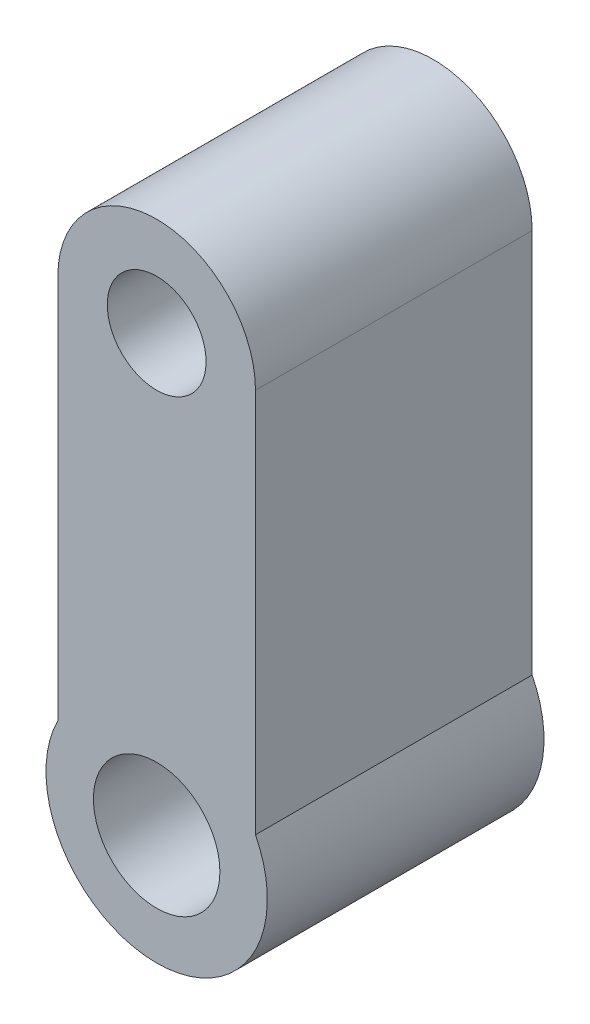
ISO-10303-21;
HEADER;
FILE_DESCRIPTION(('STEP AP214'),'2;1');
FILE_NAME('part.step','',(''),(''),'','','');
FILE_SCHEMA(('AUTOMOTIVE_DESIGN { 1 0 10303 214 1 1 1 1 }'));
ENDSEC;
DATA;
#1=APPLICATION_CONTEXT('core data for automotive mechanical design processes');
#2=APPLICATION_PROTOCOL_DEFINITION('international standard','automotive_design',2000,#1);
#3=PRODUCT_CONTEXT('',#1,'mechanical');
#4=PRODUCT('Part','Part','',(#3));
#5=PRODUCT_RELATED_PRODUCT_CATEGORY('part','',(#4));
#6=PRODUCT_DEFINITION_FORMATION('','',#4);
#7=PRODUCT_DEFINITION_CONTEXT('part definition',#1,'design');
#8=PRODUCT_DEFINITION('design','',#6,#7);
#9=PRODUCT_DEFINITION_SHAPE('','',#8);
#10=(LENGTH_UNIT() NAMED_UNIT(*) SI_UNIT(.MILLI.,.METRE.));
#11=(NAMED_UNIT(*) PLANE_ANGLE_UNIT() SI_UNIT($,.RADIAN.));
#12=(NAMED_UNIT(*) SI_UNIT($,.STERADIAN.) SOLID_ANGLE_UNIT());
#13=UNCERTAINTY_MEASURE_WITH_UNIT(LENGTH_MEASURE(1.E-05),#10,'distance_accuracy_value','');
#14=(GEOMETRIC_REPRESENTATION_CONTEXT(3) GLOBAL_UNCERTAINTY_ASSIGNED_CONTEXT((#13)) GLOBAL_UNIT_ASSIGNED_CONTEXT((#10,
#11,#12)) REPRESENTATION_CONTEXT('',''));
#15=CARTESIAN_POINT('',(0.,0.,0.));
#16=DIRECTION('',(0.,0.,1.));
#17=DIRECTION('',(1.,0.,0.));
#18=AXIS2_PLACEMENT_3D('',#15,#16,#17);
#19=CARTESIAN_POINT('',(25.,0.,35.));
#20=DIRECTION('',(-1.,0.,0.));
#21=DIRECTION('',(0.,-1.,0.));
#22=AXIS2_PLACEMENT_3D('',#19,#20,#21);
#23=PLANE('',#22);
#24=DIRECTION('',(0.,1.,0.));
#25=VECTOR('',#24,1.);
#26=CARTESIAN_POINT('',(25.,0.,-35.));
#27=LINE('',#26,#25);
#28=CARTESIAN_POINT('',(25.,12.6095202129185,-35.));
#29=VERTEX_POINT('',#28);
#30=CARTESIAN_POINT('',(25.,110.,-35.));
#31=VERTEX_POINT('',#30);
#32=EDGE_CURVE('E104',#29,#31,#27,.T.);
#33=ORIENTED_EDGE('',*,*,#32,.T.);
#34=DIRECTION('',(0.,0.,-1.));
#35=VECTOR('',#34,1.);
#36=CARTESIAN_POINT('',(25.,110.,35.));
#37=LINE('',#36,#35);
#38=CARTESIAN_POINT('',(25.,110.,35.));
#39=VERTEX_POINT('',#38);
#40=EDGE_CURVE('E11',#39,#31,#37,.T.);
#41=ORIENTED_EDGE('',*,*,#40,.F.);
#42=DIRECTION('',(0.,1.,0.));
#43=VECTOR('',#42,1.);
#44=CARTESIAN_POINT('',(25.,0.,35.));
#45=LINE('',#44,#43);
#46=CARTESIAN_POINT('',(25.,12.6095202129185,35.));
#47=VERTEX_POINT('',#46);
#48=EDGE_CURVE('E83',#47,#39,#45,.T.);
#49=ORIENTED_EDGE('',*,*,#48,.F.);
#50=DIRECTION('',(0.,0.,-1.));
#51=VECTOR('',#50,1.);
#52=CARTESIAN_POINT('',(25.,12.6095202129185,35.));
#53=LINE('',#52,#51);
#54=EDGE_CURVE('E103',#47,#29,#53,.T.);
#55=ORIENTED_EDGE('',*,*,#54,.T.);
#56=EDGE_LOOP('',(#33,#41,#49,#55));
#57=FACE_BOUND('',#56,.T.);
#58=ADVANCED_FACE('F35',(#57),#23,.F.);
#59=CARTESIAN_POINT('',(0.,110.,35.));
#60=DIRECTION('',(0.,0.,-1.));
#61=DIRECTION('',(-1.,0.,0.));
#62=AXIS2_PLACEMENT_3D('',#59,#60,#61);
#63=CYLINDRICAL_SURFACE('',#62,25.);
#64=CARTESIAN_POINT('',(0.,110.,-35.));
#65=DIRECTION('',(0.,0.,1.));
#66=DIRECTION('',(1.,0.,0.));
#67=AXIS2_PLACEMENT_3D('',#64,#65,#66);
#68=CIRCLE('',#67,25.);
#69=CARTESIAN_POINT('',(-25.,110.,-35.));
#70=VERTEX_POINT('',#69);
#71=EDGE_CURVE('E88',#31,#70,#68,.T.);
#72=ORIENTED_EDGE('',*,*,#71,.T.);
#73=DIRECTION('',(0.,0.,-1.));
#74=VECTOR('',#73,1.);
#75=CARTESIAN_POINT('',(-25.,110.,35.));
#76=LINE('',#75,#74);
#77=CARTESIAN_POINT('',(-25.,110.,35.));
#78=VERTEX_POINT('',#77);
#79=EDGE_CURVE('E43',#78,#70,#76,.T.);
#80=ORIENTED_EDGE('',*,*,#79,.F.);
#81=CARTESIAN_POINT('',(0.,110.,35.));
#82=DIRECTION('',(0.,0.,1.));
#83=DIRECTION('',(1.,0.,0.));
#84=AXIS2_PLACEMENT_3D('',#81,#82,#83);
#85=CIRCLE('',#84,25.);
#86=EDGE_CURVE('E77',#39,#78,#85,.T.);
#87=ORIENTED_EDGE('',*,*,#86,.F.);
#88=ORIENTED_EDGE('',*,*,#40,.T.);
#89=EDGE_LOOP('',(#72,#80,#87,#88));
#90=FACE_BOUND('',#89,.T.);
#91=ADVANCED_FACE('F87',(#90),#63,.T.);
#92=CARTESIAN_POINT('',(-25.,0.,35.));
#93=DIRECTION('',(-1.,0.,0.));
#94=DIRECTION('',(0.,-1.,0.));
#95=AXIS2_PLACEMENT_3D('',#92,#93,#94);
#96=PLANE('',#95);
#97=DIRECTION('',(0.,1.,0.));
#98=VECTOR('',#97,1.);
#99=CARTESIAN_POINT('',(-25.,0.,-35.));
#100=LINE('',#99,#98);
#101=CARTESIAN_POINT('',(-25.,12.6095202129185,-35.));
#102=VERTEX_POINT('',#101);
#103=EDGE_CURVE('E108',#102,#70,#100,.T.);
#104=ORIENTED_EDGE('',*,*,#103,.F.);
#105=DIRECTION('',(0.,0.,-1.));
#106=VECTOR('',#105,1.);
#107=CARTESIAN_POINT('',(-25.,12.6095202129185,35.));
#108=LINE('',#107,#106);
#109=CARTESIAN_POINT('',(-25.,12.6095202129185,35.));
#110=VERTEX_POINT('',#109);
#111=EDGE_CURVE('E67',#110,#102,#108,.T.);
#112=ORIENTED_EDGE('',*,*,#111,.F.);
#113=DIRECTION('',(0.,1.,0.));
#114=VECTOR('',#113,1.);
#115=CARTESIAN_POINT('',(-25.,0.,35.));
#116=LINE('',#115,#114);
#117=EDGE_CURVE('E81',#110,#78,#116,.T.);
#118=ORIENTED_EDGE('',*,*,#117,.T.);
#119=ORIENTED_EDGE('',*,*,#79,.T.);
#120=EDGE_LOOP('',(#104,#112,#118,#119));
#121=FACE_BOUND('',#120,.T.);
#122=ADVANCED_FACE('F92',(#121),#96,.T.);
#123=CARTESIAN_POINT('',(0.,0.,35.));
#124=DIRECTION('',(0.,0.,-1.));
#125=DIRECTION('',(-1.,0.,0.));
#126=AXIS2_PLACEMENT_3D('',#123,#124,#125);
#127=CYLINDRICAL_SURFACE('',#126,16.);
#128=CARTESIAN_POINT('',(0.,0.,35.));
#129=DIRECTION('',(0.,0.,1.));
#130=DIRECTION('',(1.,0.,0.));
#131=AXIS2_PLACEMENT_3D('',#128,#129,#130);
#132=CIRCLE('',#131,16.);
#133=CARTESIAN_POINT('',(16.,0.,35.));
#134=VERTEX_POINT('',#133);
#135=EDGE_CURVE('E94',#134,#134,#132,.T.);
#136=ORIENTED_EDGE('',*,*,#135,.T.);
#137=EDGE_LOOP('',(#136));
#138=FACE_BOUND('',#137,.T.);
#139=CARTESIAN_POINT('',(0.,0.,-35.));
#140=DIRECTION('',(0.,0.,1.));
#141=DIRECTION('',(1.,0.,0.));
#142=AXIS2_PLACEMENT_3D('',#139,#140,#141);
#143=CIRCLE('',#142,16.);
#144=CARTESIAN_POINT('',(16.,0.,-35.));
#145=VERTEX_POINT('',#144);
#146=EDGE_CURVE('E111',#145,#145,#143,.T.);
#147=ORIENTED_EDGE('',*,*,#146,.F.);
#148=EDGE_LOOP('',(#147));
#149=FACE_BOUND('',#148,.T.);
#150=ADVANCED_FACE('F139',(#138,#149),#127,.F.);
#151=CARTESIAN_POINT('',(0.,0.,35.));
#152=DIRECTION('',(0.,0.,-1.));
#153=DIRECTION('',(-1.,0.,0.));
#154=AXIS2_PLACEMENT_3D('',#151,#152,#153);
#155=CYLINDRICAL_SURFACE('',#154,28.);
#156=CARTESIAN_POINT('',(0.,0.,-35.));
#157=DIRECTION('',(0.,0.,1.));
#158=DIRECTION('',(1.,0.,0.));
#159=AXIS2_PLACEMENT_3D('',#156,#157,#158);
#160=CIRCLE('',#159,28.);
#161=EDGE_CURVE('E70',#102,#29,#160,.T.);
#162=ORIENTED_EDGE('',*,*,#161,.T.);
#163=ORIENTED_EDGE('',*,*,#54,.F.);
#164=CARTESIAN_POINT('',(0.,0.,35.));
#165=DIRECTION('',(0.,0.,1.));
#166=DIRECTION('',(1.,0.,0.));
#167=AXIS2_PLACEMENT_3D('',#164,#165,#166);
#168=CIRCLE('',#167,28.);
#169=EDGE_CURVE('E51',#110,#47,#168,.T.);
#170=ORIENTED_EDGE('',*,*,#169,.F.);
#171=ORIENTED_EDGE('',*,*,#111,.T.);
#172=EDGE_LOOP('',(#162,#163,#170,#171));
#173=FACE_BOUND('',#172,.T.);
#174=ADVANCED_FACE('F131',(#173),#155,.T.);
#175=CARTESIAN_POINT('',(0.,110.,35.));
#176=DIRECTION('',(0.,0.,-1.));
#177=DIRECTION('',(-1.,0.,0.));
#178=AXIS2_PLACEMENT_3D('',#175,#176,#177);
#179=CYLINDRICAL_SURFACE('',#178,12.5);
#180=CARTESIAN_POINT('',(0.,110.,35.));
#181=DIRECTION('',(0.,0.,1.));
#182=DIRECTION('',(1.,0.,0.));
#183=AXIS2_PLACEMENT_3D('',#180,#181,#182);
#184=CIRCLE('',#183,12.5);
#185=CARTESIAN_POINT('',(12.5,110.,35.));
#186=VERTEX_POINT('',#185);
#187=EDGE_CURVE('E100',#186,#186,#184,.T.);
#188=ORIENTED_EDGE('',*,*,#187,.T.);
#189=EDGE_LOOP('',(#188));
#190=FACE_BOUND('',#189,.T.);
#191=CARTESIAN_POINT('',(0.,110.,-35.));
#192=DIRECTION('',(0.,0.,1.));
#193=DIRECTION('',(1.,0.,0.));
#194=AXIS2_PLACEMENT_3D('',#191,#192,#193);
#195=CIRCLE('',#194,12.5);
#196=CARTESIAN_POINT('',(12.5,110.,-35.));
#197=VERTEX_POINT('',#196);
#198=EDGE_CURVE('E114',#197,#197,#195,.T.);
#199=ORIENTED_EDGE('',*,*,#198,.F.);
#200=EDGE_LOOP('',(#199));
#201=FACE_BOUND('',#200,.T.);
#202=ADVANCED_FACE('F129',(#190,#201),#179,.F.);
#203=CARTESIAN_POINT('',(0.,0.,35.));
#204=DIRECTION('',(0.,0.,1.));
#205=DIRECTION('',(1.,0.,0.));
#206=AXIS2_PLACEMENT_3D('',#203,#204,#205);
#207=PLANE('',#206);
#208=ORIENTED_EDGE('',*,*,#48,.T.);
#209=ORIENTED_EDGE('',*,*,#86,.T.);
#210=ORIENTED_EDGE('',*,*,#117,.F.);
#211=ORIENTED_EDGE('',*,*,#169,.T.);
#212=EDGE_LOOP('',(#208,#209,#210,#211));
#213=FACE_BOUND('',#212,.T.);
#214=ORIENTED_EDGE('',*,*,#135,.F.);
#215=EDGE_LOOP('',(#214));
#216=FACE_BOUND('',#215,.T.);
#217=ORIENTED_EDGE('',*,*,#187,.F.);
#218=EDGE_LOOP('',(#217));
#219=FACE_BOUND('',#218,.T.);
#220=ADVANCED_FACE('F78',(#213,#216,#219),#207,.T.);
#221=CARTESIAN_POINT('',(0.,0.,-35.));
#222=DIRECTION('',(0.,0.,1.));
#223=DIRECTION('',(1.,0.,0.));
#224=AXIS2_PLACEMENT_3D('',#221,#222,#223);
#225=PLANE('',#224);
#226=ORIENTED_EDGE('',*,*,#32,.F.);
#227=ORIENTED_EDGE('',*,*,#161,.F.);
#228=ORIENTED_EDGE('',*,*,#103,.T.);
#229=ORIENTED_EDGE('',*,*,#71,.F.);
#230=EDGE_LOOP('',(#226,#227,#228,#229));
#231=FACE_BOUND('',#230,.T.);
#232=ORIENTED_EDGE('',*,*,#146,.T.);
#233=EDGE_LOOP('',(#232));
#234=FACE_BOUND('',#233,.T.);
#235=ORIENTED_EDGE('',*,*,#198,.T.);
#236=EDGE_LOOP('',(#235));
#237=FACE_BOUND('',#236,.T.);
#238=ADVANCED_FACE('F121',(#231,#234,#237),#225,.F.);
#239=CLOSED_SHELL('',(#58,#91,#122,#150,#174,#202,#220,#238));
#240=MANIFOLD_SOLID_BREP('B2',#239);
#241=ADVANCED_BREP_SHAPE_REPRESENTATION('',(#18,#240),#14);
#242=SHAPE_DEFINITION_REPRESENTATION(#9,#241);
ENDSEC;
END-ISO-10303-21;
